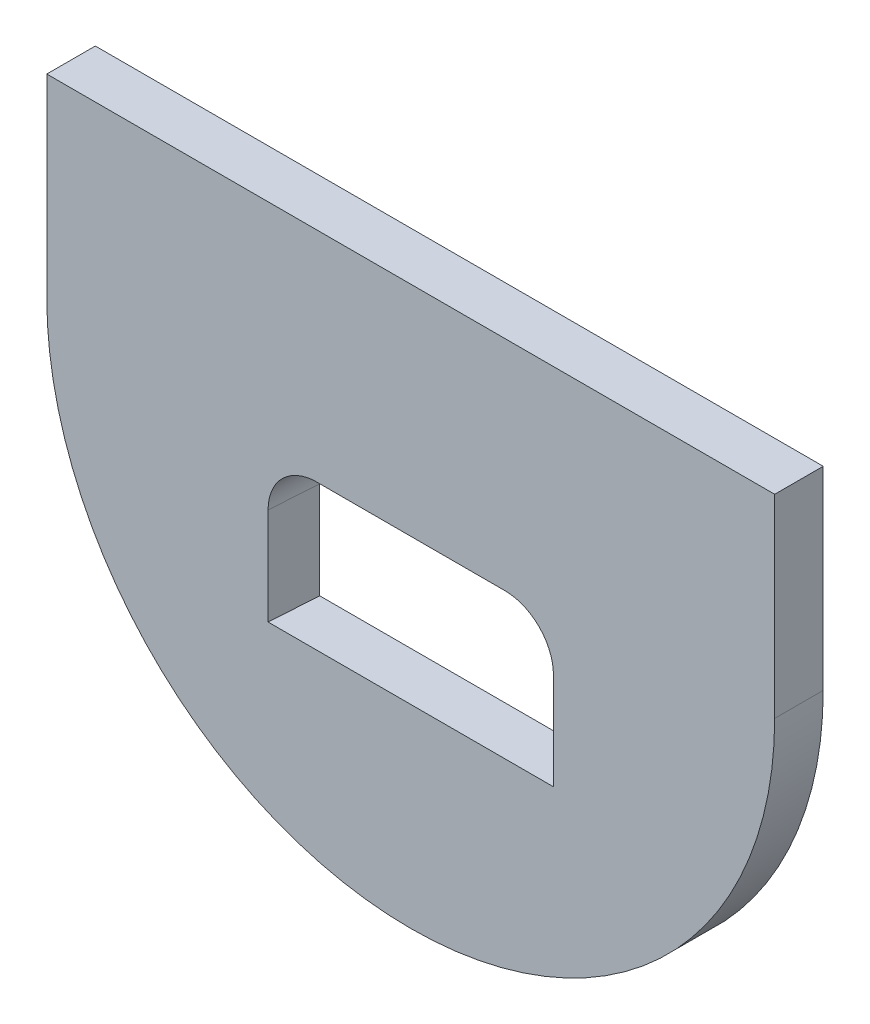
ISO-10303-21;
HEADER;
FILE_DESCRIPTION(('STEP AP214'),'2;1');
FILE_NAME('part.step','',(''),(''),'','','');
FILE_SCHEMA(('AUTOMOTIVE_DESIGN { 1 0 10303 214 1 1 1 1 }'));
ENDSEC;
DATA;
#1=APPLICATION_CONTEXT('core data for automotive mechanical design processes');
#2=APPLICATION_PROTOCOL_DEFINITION('international standard','automotive_design',2000,#1);
#3=PRODUCT_CONTEXT('',#1,'mechanical');
#4=PRODUCT('Part','Part','',(#3));
#5=PRODUCT_RELATED_PRODUCT_CATEGORY('part','',(#4));
#6=PRODUCT_DEFINITION_FORMATION('','',#4);
#7=PRODUCT_DEFINITION_CONTEXT('part definition',#1,'design');
#8=PRODUCT_DEFINITION('design','',#6,#7);
#9=PRODUCT_DEFINITION_SHAPE('','',#8);
#10=(LENGTH_UNIT() NAMED_UNIT(*) SI_UNIT(.MILLI.,.METRE.));
#11=(NAMED_UNIT(*) PLANE_ANGLE_UNIT() SI_UNIT($,.RADIAN.));
#12=(NAMED_UNIT(*) SI_UNIT($,.STERADIAN.) SOLID_ANGLE_UNIT());
#13=UNCERTAINTY_MEASURE_WITH_UNIT(LENGTH_MEASURE(1.E-05),#10,'distance_accuracy_value','');
#14=(GEOMETRIC_REPRESENTATION_CONTEXT(3) GLOBAL_UNCERTAINTY_ASSIGNED_CONTEXT((#13)) GLOBAL_UNIT_ASSIGNED_CONTEXT((#10,
#11,#12)) REPRESENTATION_CONTEXT('',''));
#15=CARTESIAN_POINT('',(0.,0.,0.));
#16=DIRECTION('',(0.,0.,1.));
#17=DIRECTION('',(1.,0.,0.));
#18=AXIS2_PLACEMENT_3D('',#15,#16,#17);
#19=CARTESIAN_POINT('',(-75.,-40.,10.));
#20=DIRECTION('',(0.,0.,-1.));
#21=DIRECTION('',(-1.,0.,0.));
#22=AXIS2_PLACEMENT_3D('',#19,#20,#21);
#23=PLANE('',#22);
#24=CARTESIAN_POINT('',(-75.,-40.,10.));
#25=DIRECTION('',(0.,0.,1.));
#26=DIRECTION('',(-1.,0.,0.));
#27=AXIS2_PLACEMENT_3D('',#24,#25,#26);
#28=CIRCLE('',#27,75.);
#29=CARTESIAN_POINT('',(-150.,-40.,10.));
#30=VERTEX_POINT('',#29);
#31=CARTESIAN_POINT('',(0.,-40.,10.));
#32=VERTEX_POINT('',#31);
#33=EDGE_CURVE('E154',#30,#32,#28,.T.);
#34=ORIENTED_EDGE('',*,*,#33,.T.);
#35=DIRECTION('',(0.,1.,0.));
#36=VECTOR('',#35,1.);
#37=CARTESIAN_POINT('',(0.,-40.,10.));
#38=LINE('',#37,#36);
#39=CARTESIAN_POINT('',(0.,0.,10.));
#40=VERTEX_POINT('',#39);
#41=EDGE_CURVE('E158',#32,#40,#38,.T.);
#42=ORIENTED_EDGE('',*,*,#41,.T.);
#43=DIRECTION('',(-1.,0.,0.));
#44=VECTOR('',#43,1.);
#45=CARTESIAN_POINT('',(0.,0.,10.));
#46=LINE('',#45,#44);
#47=CARTESIAN_POINT('',(-150.,0.,10.));
#48=VERTEX_POINT('',#47);
#49=EDGE_CURVE('E162',#40,#48,#46,.T.);
#50=ORIENTED_EDGE('',*,*,#49,.T.);
#51=DIRECTION('',(0.,-1.,0.));
#52=VECTOR('',#51,1.);
#53=CARTESIAN_POINT('',(-150.,0.,10.));
#54=LINE('',#53,#52);
#55=EDGE_CURVE('E165',#48,#30,#54,.T.);
#56=ORIENTED_EDGE('',*,*,#55,.T.);
#57=EDGE_LOOP('',(#34,#42,#50,#56));
#58=FACE_BOUND('',#57,.T.);
#59=DIRECTION('',(-1.,0.,0.));
#60=VECTOR('',#59,1.);
#61=CARTESIAN_POINT('',(-103.75,-45.,10.));
#62=LINE('',#61,#60);
#63=CARTESIAN_POINT('',(-55.6225769700738,-45.,10.));
#64=VERTEX_POINT('',#63);
#65=CARTESIAN_POINT('',(-94.3774230299262,-45.,10.));
#66=VERTEX_POINT('',#65);
#67=EDGE_CURVE('E174',#64,#66,#62,.T.);
#68=ORIENTED_EDGE('',*,*,#67,.F.);
#69=CARTESIAN_POINT('',(-55.6225769700738,-55.,10.));
#70=DIRECTION('',(0.,0.,-1.));
#71=DIRECTION('',(-1.,0.,0.));
#72=AXIS2_PLACEMENT_3D('',#69,#70,#71);
#73=ELLIPSE('',#72,10.0210006095303,10.);
#74=CARTESIAN_POINT('',(-45.6015763605435,-55.,10.));
#75=VERTEX_POINT('',#74);
#76=EDGE_CURVE('E216',#64,#75,#73,.T.);
#77=ORIENTED_EDGE('',*,*,#76,.T.);
#78=DIRECTION('',(0.,-1.,0.));
#79=VECTOR('',#78,1.);
#80=CARTESIAN_POINT('',(-45.6015763605435,-75.,10.));
#81=LINE('',#80,#79);
#82=CARTESIAN_POINT('',(-45.6015763605435,-75.,10.));
#83=VERTEX_POINT('',#82);
#84=EDGE_CURVE('E199',#75,#83,#81,.T.);
#85=ORIENTED_EDGE('',*,*,#84,.T.);
#86=DIRECTION('',(1.,0.,0.));
#87=VECTOR('',#86,1.);
#88=CARTESIAN_POINT('',(-103.75,-75.,10.));
#89=LINE('',#88,#87);
#90=CARTESIAN_POINT('',(-104.398423639456,-75.,10.));
#91=VERTEX_POINT('',#90);
#92=EDGE_CURVE('E153',#91,#83,#89,.T.);
#93=ORIENTED_EDGE('',*,*,#92,.F.);
#94=DIRECTION('',(0.,1.,0.));
#95=VECTOR('',#94,1.);
#96=CARTESIAN_POINT('',(-104.398423639456,-45.,10.));
#97=LINE('',#96,#95);
#98=CARTESIAN_POINT('',(-104.398423639456,-55.,10.));
#99=VERTEX_POINT('',#98);
#100=EDGE_CURVE('E134',#91,#99,#97,.T.);
#101=ORIENTED_EDGE('',*,*,#100,.T.);
#102=CARTESIAN_POINT('',(-94.3774230299262,-55.,10.));
#103=DIRECTION('',(0.,0.,-1.));
#104=DIRECTION('',(-1.,0.,0.));
#105=AXIS2_PLACEMENT_3D('',#102,#103,#104);
#106=ELLIPSE('',#105,10.0210006095303,10.);
#107=EDGE_CURVE('E11',#99,#66,#106,.T.);
#108=ORIENTED_EDGE('',*,*,#107,.T.);
#109=EDGE_LOOP('',(#68,#77,#85,#93,#101,#108));
#110=FACE_BOUND('',#109,.T.);
#111=ADVANCED_FACE('F47',(#58,#110),#23,.F.);
#112=CARTESIAN_POINT('',(-75.,-40.,0.));
#113=DIRECTION('',(0.,0.,-1.));
#114=DIRECTION('',(-1.,0.,0.));
#115=AXIS2_PLACEMENT_3D('',#112,#113,#114);
#116=PLANE('',#115);
#117=CARTESIAN_POINT('',(-75.,-40.,0.));
#118=DIRECTION('',(0.,0.,1.));
#119=DIRECTION('',(-1.,0.,0.));
#120=AXIS2_PLACEMENT_3D('',#117,#118,#119);
#121=CIRCLE('',#120,75.);
#122=CARTESIAN_POINT('',(-150.,-40.,0.));
#123=VERTEX_POINT('',#122);
#124=CARTESIAN_POINT('',(0.,-40.,0.));
#125=VERTEX_POINT('',#124);
#126=EDGE_CURVE('E169',#123,#125,#121,.T.);
#127=ORIENTED_EDGE('',*,*,#126,.F.);
#128=DIRECTION('',(0.,-1.,0.));
#129=VECTOR('',#128,1.);
#130=CARTESIAN_POINT('',(-150.,0.,0.));
#131=LINE('',#130,#129);
#132=CARTESIAN_POINT('',(-150.,0.,0.));
#133=VERTEX_POINT('',#132);
#134=EDGE_CURVE('E159',#133,#123,#131,.T.);
#135=ORIENTED_EDGE('',*,*,#134,.F.);
#136=DIRECTION('',(-1.,0.,0.));
#137=VECTOR('',#136,1.);
#138=CARTESIAN_POINT('',(0.,0.,0.));
#139=LINE('',#138,#137);
#140=CARTESIAN_POINT('',(0.,0.,0.));
#141=VERTEX_POINT('',#140);
#142=EDGE_CURVE('E177',#141,#133,#139,.T.);
#143=ORIENTED_EDGE('',*,*,#142,.F.);
#144=DIRECTION('',(0.,1.,0.));
#145=VECTOR('',#144,1.);
#146=CARTESIAN_POINT('',(0.,-40.,0.));
#147=LINE('',#146,#145);
#148=EDGE_CURVE('E173',#125,#141,#147,.T.);
#149=ORIENTED_EDGE('',*,*,#148,.F.);
#150=EDGE_LOOP('',(#127,#135,#143,#149));
#151=FACE_BOUND('',#150,.T.);
#152=DIRECTION('',(0.,1.,0.));
#153=VECTOR('',#152,1.);
#154=CARTESIAN_POINT('',(-46.25,-45.,0.));
#155=LINE('',#154,#153);
#156=CARTESIAN_POINT('',(-46.25,-75.,0.));
#157=VERTEX_POINT('',#156);
#158=CARTESIAN_POINT('',(-46.25,-55.,0.));
#159=VERTEX_POINT('',#158);
#160=EDGE_CURVE('E144',#157,#159,#155,.T.);
#161=ORIENTED_EDGE('',*,*,#160,.T.);
#162=CARTESIAN_POINT('',(-56.2710006095302,-55.,0.));
#163=DIRECTION('',(0.,0.,-1.));
#164=DIRECTION('',(-1.,0.,0.));
#165=AXIS2_PLACEMENT_3D('',#162,#163,#164);
#166=ELLIPSE('',#165,10.0210006095303,10.);
#167=CARTESIAN_POINT('',(-56.2710006095302,-45.,0.));
#168=VERTEX_POINT('',#167);
#169=EDGE_CURVE('E219',#159,#168,#166,.F.);
#170=ORIENTED_EDGE('',*,*,#169,.T.);
#171=DIRECTION('',(-1.,0.,0.));
#172=VECTOR('',#171,1.);
#173=CARTESIAN_POINT('',(-103.75,-45.,0.));
#174=LINE('',#173,#172);
#175=CARTESIAN_POINT('',(-93.7289993904698,-45.,0.));
#176=VERTEX_POINT('',#175);
#177=EDGE_CURVE('E147',#168,#176,#174,.T.);
#178=ORIENTED_EDGE('',*,*,#177,.T.);
#179=CARTESIAN_POINT('',(-93.7289993904698,-55.,0.));
#180=DIRECTION('',(0.,0.,-1.));
#181=DIRECTION('',(-1.,0.,0.));
#182=AXIS2_PLACEMENT_3D('',#179,#180,#181);
#183=ELLIPSE('',#182,10.0210006095303,10.);
#184=CARTESIAN_POINT('',(-103.75,-55.,0.));
#185=VERTEX_POINT('',#184);
#186=EDGE_CURVE('E56',#176,#185,#183,.F.);
#187=ORIENTED_EDGE('',*,*,#186,.T.);
#188=DIRECTION('',(0.,-1.,0.));
#189=VECTOR('',#188,1.);
#190=CARTESIAN_POINT('',(-103.75,-45.,0.));
#191=LINE('',#190,#189);
#192=CARTESIAN_POINT('',(-103.75,-75.,0.));
#193=VERTEX_POINT('',#192);
#194=EDGE_CURVE('E122',#185,#193,#191,.T.);
#195=ORIENTED_EDGE('',*,*,#194,.T.);
#196=DIRECTION('',(1.,0.,0.));
#197=VECTOR('',#196,1.);
#198=CARTESIAN_POINT('',(-103.75,-75.,0.));
#199=LINE('',#198,#197);
#200=EDGE_CURVE('E127',#193,#157,#199,.T.);
#201=ORIENTED_EDGE('',*,*,#200,.T.);
#202=EDGE_LOOP('',(#161,#170,#178,#187,#195,#201));
#203=FACE_BOUND('',#202,.T.);
#204=ADVANCED_FACE('F125',(#151,#203),#116,.T.);
#205=CARTESIAN_POINT('',(-75.,-40.,10.));
#206=DIRECTION('',(0.,0.,-1.));
#207=DIRECTION('',(-1.,0.,0.));
#208=AXIS2_PLACEMENT_3D('',#205,#206,#207);
#209=CYLINDRICAL_SURFACE('',#208,75.);
#210=ORIENTED_EDGE('',*,*,#126,.T.);
#211=DIRECTION('',(0.,0.,-1.));
#212=VECTOR('',#211,1.);
#213=CARTESIAN_POINT('',(0.,-40.,10.));
#214=LINE('',#213,#212);
#215=EDGE_CURVE('E193',#32,#125,#214,.T.);
#216=ORIENTED_EDGE('',*,*,#215,.F.);
#217=ORIENTED_EDGE('',*,*,#33,.F.);
#218=DIRECTION('',(0.,0.,-1.));
#219=VECTOR('',#218,1.);
#220=CARTESIAN_POINT('',(-150.,-40.,10.));
#221=LINE('',#220,#219);
#222=EDGE_CURVE('E168',#30,#123,#221,.T.);
#223=ORIENTED_EDGE('',*,*,#222,.T.);
#224=EDGE_LOOP('',(#210,#216,#217,#223));
#225=FACE_BOUND('',#224,.T.);
#226=ADVANCED_FACE('F253',(#225),#209,.T.);
#227=CARTESIAN_POINT('',(0.,-40.,10.));
#228=DIRECTION('',(-1.,0.,0.));
#229=DIRECTION('',(0.,0.,1.));
#230=AXIS2_PLACEMENT_3D('',#227,#228,#229);
#231=PLANE('',#230);
#232=ORIENTED_EDGE('',*,*,#148,.T.);
#233=DIRECTION('',(0.,0.,-1.));
#234=VECTOR('',#233,1.);
#235=CARTESIAN_POINT('',(0.,0.,10.));
#236=LINE('',#235,#234);
#237=EDGE_CURVE('E189',#40,#141,#236,.T.);
#238=ORIENTED_EDGE('',*,*,#237,.F.);
#239=ORIENTED_EDGE('',*,*,#41,.F.);
#240=ORIENTED_EDGE('',*,*,#215,.T.);
#241=EDGE_LOOP('',(#232,#238,#239,#240));
#242=FACE_BOUND('',#241,.T.);
#243=ADVANCED_FACE('F266',(#242),#231,.F.);
#244=CARTESIAN_POINT('',(0.,0.,10.));
#245=DIRECTION('',(0.,-1.,0.));
#246=DIRECTION('',(0.,0.,-1.));
#247=AXIS2_PLACEMENT_3D('',#244,#245,#246);
#248=PLANE('',#247);
#249=ORIENTED_EDGE('',*,*,#142,.T.);
#250=DIRECTION('',(0.,0.,-1.));
#251=VECTOR('',#250,1.);
#252=CARTESIAN_POINT('',(-150.,0.,10.));
#253=LINE('',#252,#251);
#254=EDGE_CURVE('E185',#48,#133,#253,.T.);
#255=ORIENTED_EDGE('',*,*,#254,.F.);
#256=ORIENTED_EDGE('',*,*,#49,.F.);
#257=ORIENTED_EDGE('',*,*,#237,.T.);
#258=EDGE_LOOP('',(#249,#255,#256,#257));
#259=FACE_BOUND('',#258,.T.);
#260=ADVANCED_FACE('F262',(#259),#248,.F.);
#261=CARTESIAN_POINT('',(-150.,0.,10.));
#262=DIRECTION('',(1.,0.,0.));
#263=DIRECTION('',(0.,1.,0.));
#264=AXIS2_PLACEMENT_3D('',#261,#262,#263);
#265=PLANE('',#264);
#266=ORIENTED_EDGE('',*,*,#134,.T.);
#267=ORIENTED_EDGE('',*,*,#222,.F.);
#268=ORIENTED_EDGE('',*,*,#55,.F.);
#269=ORIENTED_EDGE('',*,*,#254,.T.);
#270=EDGE_LOOP('',(#266,#267,#268,#269));
#271=FACE_BOUND('',#270,.T.);
#272=ADVANCED_FACE('F259',(#271),#265,.F.);
#273=CARTESIAN_POINT('',(-103.75,-75.,10.));
#274=DIRECTION('',(0.,1.,0.));
#275=DIRECTION('',(0.,0.,1.));
#276=AXIS2_PLACEMENT_3D('',#273,#274,#275);
#277=PLANE('',#276);
#278=ORIENTED_EDGE('',*,*,#200,.F.);
#279=DIRECTION('',(-0.0647064764011459,0.,0.997904340060583));
#280=VECTOR('',#279,1.);
#281=CARTESIAN_POINT('',(-103.75,-75.,-6.46155755656537E-13));
#282=LINE('',#281,#280);
#283=EDGE_CURVE('E132',#193,#91,#282,.T.);
#284=ORIENTED_EDGE('',*,*,#283,.T.);
#285=ORIENTED_EDGE('',*,*,#92,.T.);
#286=DIRECTION('',(-0.0647064764011468,0.,-0.997904340060583));
#287=VECTOR('',#286,1.);
#288=CARTESIAN_POINT('',(-46.25,-75.,-5.07377877578392E-13));
#289=LINE('',#288,#287);
#290=EDGE_CURVE('E139',#83,#157,#289,.T.);
#291=ORIENTED_EDGE('',*,*,#290,.T.);
#292=EDGE_LOOP('',(#278,#284,#285,#291));
#293=FACE_BOUND('',#292,.T.);
#294=ADVANCED_FACE('F141',(#293),#277,.T.);
#295=CARTESIAN_POINT('',(-103.75,-45.,10.));
#296=DIRECTION('',(0.,-1.,0.));
#297=DIRECTION('',(0.,0.,-1.));
#298=AXIS2_PLACEMENT_3D('',#295,#296,#297);
#299=PLANE('',#298);
#300=ORIENTED_EDGE('',*,*,#177,.F.);
#301=DIRECTION('',(0.0647064764011468,0.,0.997904340060583));
#302=VECTOR('',#301,1.);
#303=CARTESIAN_POINT('',(-55.5806197611494,-45.,10.6470647640115));
#304=LINE('',#303,#302);
#305=EDGE_CURVE('E207',#168,#64,#304,.T.);
#306=ORIENTED_EDGE('',*,*,#305,.T.);
#307=ORIENTED_EDGE('',*,*,#67,.T.);
#308=DIRECTION('',(0.0647064764011459,0.,-0.997904340060583));
#309=VECTOR('',#308,1.);
#310=CARTESIAN_POINT('',(-93.7709565993942,-45.,0.647064764011456));
#311=LINE('',#310,#309);
#312=EDGE_CURVE('E138',#66,#176,#311,.T.);
#313=ORIENTED_EDGE('',*,*,#312,.T.);
#314=EDGE_LOOP('',(#300,#306,#307,#313));
#315=FACE_BOUND('',#314,.T.);
#316=ADVANCED_FACE('F238',(#315),#299,.T.);
#317=CARTESIAN_POINT('',(-46.25,-45.,-5.08273978461204E-13));
#318=DIRECTION('',(-0.997904340060583,0.,0.0647064764011468));
#319=DIRECTION('',(0.,-1.,0.));
#320=AXIS2_PLACEMENT_3D('',#317,#318,#319);
#321=PLANE('',#320);
#322=ORIENTED_EDGE('',*,*,#84,.F.);
#323=DIRECTION('',(0.0647064764011468,0.,0.997904340060583));
#324=VECTOR('',#323,1.);
#325=CARTESIAN_POINT('',(-46.25,-55.,0.));
#326=LINE('',#325,#324);
#327=EDGE_CURVE('E211',#75,#159,#326,.F.);
#328=ORIENTED_EDGE('',*,*,#327,.T.);
#329=ORIENTED_EDGE('',*,*,#160,.F.);
#330=ORIENTED_EDGE('',*,*,#290,.F.);
#331=EDGE_LOOP('',(#322,#328,#329,#330));
#332=FACE_BOUND('',#331,.T.);
#333=ADVANCED_FACE('F229',(#332),#321,.T.);
#334=CARTESIAN_POINT('',(-103.75,-45.,-6.47051856539349E-13));
#335=DIRECTION('',(0.997904340060583,0.,0.0647064764011459));
#336=DIRECTION('',(0.,1.,0.));
#337=AXIS2_PLACEMENT_3D('',#334,#335,#336);
#338=PLANE('',#337);
#339=ORIENTED_EDGE('',*,*,#194,.F.);
#340=DIRECTION('',(0.0647064764011459,0.,-0.997904340060583));
#341=VECTOR('',#340,1.);
#342=CARTESIAN_POINT('',(-104.398423639456,-55.,10.));
#343=LINE('',#342,#341);
#344=EDGE_CURVE('E69',#185,#99,#343,.F.);
#345=ORIENTED_EDGE('',*,*,#344,.T.);
#346=ORIENTED_EDGE('',*,*,#100,.F.);
#347=ORIENTED_EDGE('',*,*,#283,.F.);
#348=EDGE_LOOP('',(#339,#345,#346,#347));
#349=FACE_BOUND('',#348,.T.);
#350=ADVANCED_FACE('F133',(#349),#338,.T.);
#351=CARTESIAN_POINT('',(-55.824083029373,-55.,6.89237024936185));
#352=DIRECTION('',(-0.0647064764011468,0.,-0.997904340060583));
#353=DIRECTION('',(-0.997904340060583,0.,0.0647064764011468));
#354=AXIS2_PLACEMENT_3D('',#351,#352,#353);
#355=CYLINDRICAL_SURFACE('',#354,10.);
#356=ORIENTED_EDGE('',*,*,#169,.F.);
#357=ORIENTED_EDGE('',*,*,#327,.F.);
#358=ORIENTED_EDGE('',*,*,#76,.F.);
#359=ORIENTED_EDGE('',*,*,#305,.F.);
#360=EDGE_LOOP('',(#356,#357,#358,#359));
#361=FACE_BOUND('',#360,.T.);
#362=ADVANCED_FACE('F235',(#361),#355,.F.);
#363=CARTESIAN_POINT('',(-94.4166653357015,-55.,10.6051954831289));
#364=DIRECTION('',(-0.0647064764011459,0.,0.997904340060583));
#365=DIRECTION('',(0.997904340060583,0.,0.0647064764011459));
#366=AXIS2_PLACEMENT_3D('',#363,#364,#365);
#367=CYLINDRICAL_SURFACE('',#366,10.);
#368=ORIENTED_EDGE('',*,*,#107,.F.);
#369=ORIENTED_EDGE('',*,*,#344,.F.);
#370=ORIENTED_EDGE('',*,*,#186,.F.);
#371=ORIENTED_EDGE('',*,*,#312,.F.);
#372=EDGE_LOOP('',(#368,#369,#370,#371));
#373=FACE_BOUND('',#372,.T.);
#374=ADVANCED_FACE('F49',(#373),#367,.F.);
#375=CLOSED_SHELL('',(#111,#204,#226,#243,#260,#272,#294,#316,#333,#350,#362,#374));
#376=MANIFOLD_SOLID_BREP('B2',#375);
#377=ADVANCED_BREP_SHAPE_REPRESENTATION('',(#18,#376),#14);
#378=SHAPE_DEFINITION_REPRESENTATION(#9,#377);
ENDSEC;
END-ISO-10303-21;
